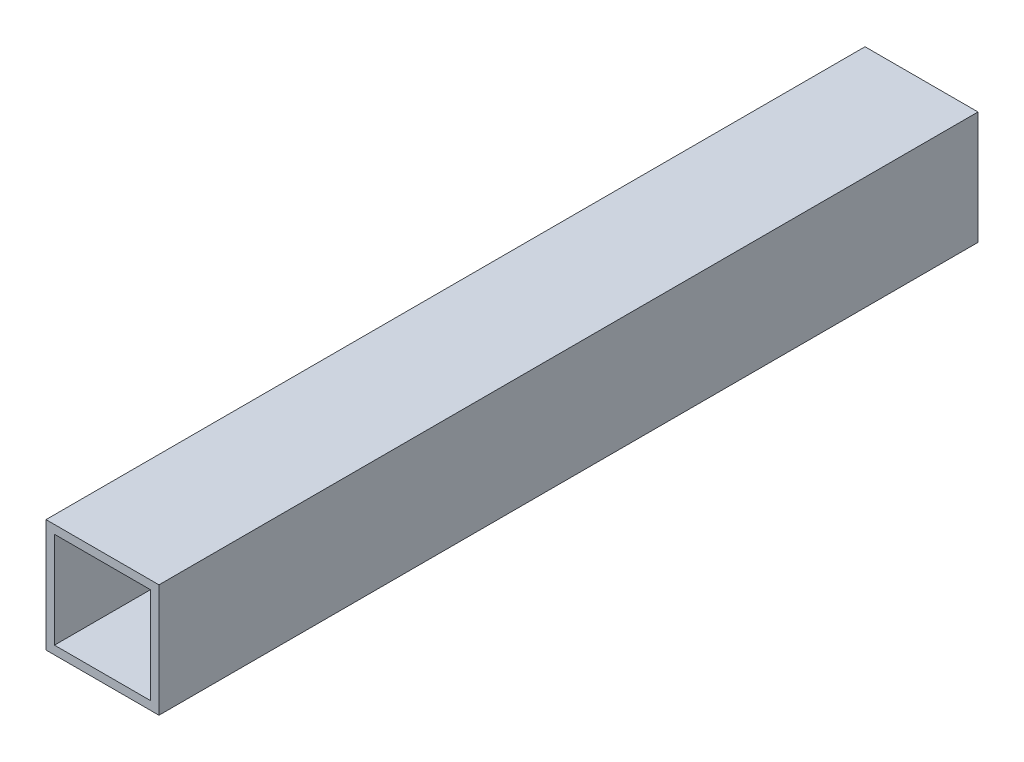
ISO-10303-21;
HEADER;
FILE_DESCRIPTION(('STEP AP214'),'2;1');
FILE_NAME('part.step','',(''),(''),'','','');
FILE_SCHEMA(('AUTOMOTIVE_DESIGN { 1 0 10303 214 1 1 1 1 }'));
ENDSEC;
DATA;
#1=APPLICATION_CONTEXT('core data for automotive mechanical design processes');
#2=APPLICATION_PROTOCOL_DEFINITION('international standard','automotive_design',2000,#1);
#3=PRODUCT_CONTEXT('',#1,'mechanical');
#4=PRODUCT('Part','Part','',(#3));
#5=PRODUCT_RELATED_PRODUCT_CATEGORY('part','',(#4));
#6=PRODUCT_DEFINITION_FORMATION('','',#4);
#7=PRODUCT_DEFINITION_CONTEXT('part definition',#1,'design');
#8=PRODUCT_DEFINITION('design','',#6,#7);
#9=PRODUCT_DEFINITION_SHAPE('','',#8);
#10=(LENGTH_UNIT() NAMED_UNIT(*) SI_UNIT(.MILLI.,.METRE.));
#11=(NAMED_UNIT(*) PLANE_ANGLE_UNIT() SI_UNIT($,.RADIAN.));
#12=(NAMED_UNIT(*) SI_UNIT($,.STERADIAN.) SOLID_ANGLE_UNIT());
#13=UNCERTAINTY_MEASURE_WITH_UNIT(LENGTH_MEASURE(1.E-05),#10,'distance_accuracy_value','');
#14=(GEOMETRIC_REPRESENTATION_CONTEXT(3) GLOBAL_UNCERTAINTY_ASSIGNED_CONTEXT((#13)) GLOBAL_UNIT_ASSIGNED_CONTEXT((#10,
#11,#12)) REPRESENTATION_CONTEXT('',''));
#15=CARTESIAN_POINT('',(0.,0.,0.));
#16=DIRECTION('',(0.,0.,1.));
#17=DIRECTION('',(1.,0.,0.));
#18=AXIS2_PLACEMENT_3D('',#15,#16,#17);
#19=CARTESIAN_POINT('',(0.,0.,72.5));
#20=DIRECTION('',(0.,0.,1.));
#21=DIRECTION('',(1.,0.,0.));
#22=AXIS2_PLACEMENT_3D('',#19,#20,#21);
#23=PLANE('',#22);
#24=DIRECTION('',(1.,0.,0.));
#25=VECTOR('',#24,1.);
#26=CARTESIAN_POINT('',(-10.,-10.,72.5));
#27=LINE('',#26,#25);
#28=CARTESIAN_POINT('',(-10.,-10.,72.5));
#29=VERTEX_POINT('',#28);
#30=CARTESIAN_POINT('',(10.,-10.,72.5));
#31=VERTEX_POINT('',#30);
#32=EDGE_CURVE('E136',#29,#31,#27,.T.);
#33=ORIENTED_EDGE('',*,*,#32,.T.);
#34=DIRECTION('',(0.,1.,0.));
#35=VECTOR('',#34,1.);
#36=CARTESIAN_POINT('',(10.,-10.,72.5));
#37=LINE('',#36,#35);
#38=CARTESIAN_POINT('',(10.,10.,72.5));
#39=VERTEX_POINT('',#38);
#40=EDGE_CURVE('E139',#31,#39,#37,.T.);
#41=ORIENTED_EDGE('',*,*,#40,.T.);
#42=DIRECTION('',(-1.,0.,0.));
#43=VECTOR('',#42,1.);
#44=CARTESIAN_POINT('',(-10.,10.,72.5));
#45=LINE('',#44,#43);
#46=CARTESIAN_POINT('',(-10.,10.,72.5));
#47=VERTEX_POINT('',#46);
#48=EDGE_CURVE('E142',#39,#47,#45,.T.);
#49=ORIENTED_EDGE('',*,*,#48,.T.);
#50=DIRECTION('',(0.,-1.,0.));
#51=VECTOR('',#50,1.);
#52=CARTESIAN_POINT('',(-10.,-10.,72.5));
#53=LINE('',#52,#51);
#54=EDGE_CURVE('E144',#47,#29,#53,.T.);
#55=ORIENTED_EDGE('',*,*,#54,.T.);
#56=EDGE_LOOP('',(#33,#41,#49,#55));
#57=FACE_BOUND('',#56,.T.);
#58=DIRECTION('',(-1.,0.,0.));
#59=VECTOR('',#58,1.);
#60=CARTESIAN_POINT('',(-8.5,8.5,72.5));
#61=LINE('',#60,#59);
#62=CARTESIAN_POINT('',(8.5,8.5,72.5));
#63=VERTEX_POINT('',#62);
#64=CARTESIAN_POINT('',(-8.5,8.5,72.5));
#65=VERTEX_POINT('',#64);
#66=EDGE_CURVE('E108',#63,#65,#61,.T.);
#67=ORIENTED_EDGE('',*,*,#66,.F.);
#68=DIRECTION('',(0.,1.,0.));
#69=VECTOR('',#68,1.);
#70=CARTESIAN_POINT('',(8.5,-8.5,72.5));
#71=LINE('',#70,#69);
#72=CARTESIAN_POINT('',(8.5,-8.5,72.5));
#73=VERTEX_POINT('',#72);
#74=EDGE_CURVE('E100',#73,#63,#71,.T.);
#75=ORIENTED_EDGE('',*,*,#74,.F.);
#76=DIRECTION('',(1.,0.,0.));
#77=VECTOR('',#76,1.);
#78=CARTESIAN_POINT('',(-8.5,-8.5,72.5));
#79=LINE('',#78,#77);
#80=CARTESIAN_POINT('',(-8.5,-8.5,72.5));
#81=VERTEX_POINT('',#80);
#82=EDGE_CURVE('E122',#81,#73,#79,.T.);
#83=ORIENTED_EDGE('',*,*,#82,.F.);
#84=DIRECTION('',(0.,-1.,0.));
#85=VECTOR('',#84,1.);
#86=CARTESIAN_POINT('',(-8.5,-8.5,72.5));
#87=LINE('',#86,#85);
#88=EDGE_CURVE('E120',#65,#81,#87,.T.);
#89=ORIENTED_EDGE('',*,*,#88,.F.);
#90=EDGE_LOOP('',(#67,#75,#83,#89));
#91=FACE_BOUND('',#90,.T.);
#92=ADVANCED_FACE('F35',(#57,#91),#23,.T.);
#93=CARTESIAN_POINT('',(0.,0.,-72.5));
#94=DIRECTION('',(0.,0.,1.));
#95=DIRECTION('',(1.,0.,0.));
#96=AXIS2_PLACEMENT_3D('',#93,#94,#95);
#97=PLANE('',#96);
#98=DIRECTION('',(1.,0.,0.));
#99=VECTOR('',#98,1.);
#100=CARTESIAN_POINT('',(-10.,-10.,-72.5));
#101=LINE('',#100,#99);
#102=CARTESIAN_POINT('',(-10.,-10.,-72.5));
#103=VERTEX_POINT('',#102);
#104=CARTESIAN_POINT('',(10.,-10.,-72.5));
#105=VERTEX_POINT('',#104);
#106=EDGE_CURVE('E116',#103,#105,#101,.T.);
#107=ORIENTED_EDGE('',*,*,#106,.F.);
#108=DIRECTION('',(0.,-1.,0.));
#109=VECTOR('',#108,1.);
#110=CARTESIAN_POINT('',(-10.,-10.,-72.5));
#111=LINE('',#110,#109);
#112=CARTESIAN_POINT('',(-10.,10.,-72.5));
#113=VERTEX_POINT('',#112);
#114=EDGE_CURVE('E140',#113,#103,#111,.T.);
#115=ORIENTED_EDGE('',*,*,#114,.F.);
#116=DIRECTION('',(-1.,0.,0.));
#117=VECTOR('',#116,1.);
#118=CARTESIAN_POINT('',(-10.,10.,-72.5));
#119=LINE('',#118,#117);
#120=CARTESIAN_POINT('',(10.,10.,-72.5));
#121=VERTEX_POINT('',#120);
#122=EDGE_CURVE('E151',#121,#113,#119,.T.);
#123=ORIENTED_EDGE('',*,*,#122,.F.);
#124=DIRECTION('',(0.,1.,0.));
#125=VECTOR('',#124,1.);
#126=CARTESIAN_POINT('',(10.,-10.,-72.5));
#127=LINE('',#126,#125);
#128=EDGE_CURVE('E149',#105,#121,#127,.T.);
#129=ORIENTED_EDGE('',*,*,#128,.F.);
#130=EDGE_LOOP('',(#107,#115,#123,#129));
#131=FACE_BOUND('',#130,.T.);
#132=DIRECTION('',(0.,1.,0.));
#133=VECTOR('',#132,1.);
#134=CARTESIAN_POINT('',(8.5,-8.5,-72.5));
#135=LINE('',#134,#133);
#136=CARTESIAN_POINT('',(8.5,-8.5,-72.5));
#137=VERTEX_POINT('',#136);
#138=CARTESIAN_POINT('',(8.5,8.5,-72.5));
#139=VERTEX_POINT('',#138);
#140=EDGE_CURVE('E58',#137,#139,#135,.T.);
#141=ORIENTED_EDGE('',*,*,#140,.T.);
#142=DIRECTION('',(-1.,0.,0.));
#143=VECTOR('',#142,1.);
#144=CARTESIAN_POINT('',(-8.5,8.5,-72.5));
#145=LINE('',#144,#143);
#146=CARTESIAN_POINT('',(-8.5,8.5,-72.5));
#147=VERTEX_POINT('',#146);
#148=EDGE_CURVE('E115',#139,#147,#145,.T.);
#149=ORIENTED_EDGE('',*,*,#148,.T.);
#150=DIRECTION('',(0.,-1.,0.));
#151=VECTOR('',#150,1.);
#152=CARTESIAN_POINT('',(-8.5,-8.5,-72.5));
#153=LINE('',#152,#151);
#154=CARTESIAN_POINT('',(-8.5,-8.5,-72.5));
#155=VERTEX_POINT('',#154);
#156=EDGE_CURVE('E128',#147,#155,#153,.T.);
#157=ORIENTED_EDGE('',*,*,#156,.T.);
#158=DIRECTION('',(1.,0.,0.));
#159=VECTOR('',#158,1.);
#160=CARTESIAN_POINT('',(-8.5,-8.5,-72.5));
#161=LINE('',#160,#159);
#162=EDGE_CURVE('E109',#155,#137,#161,.T.);
#163=ORIENTED_EDGE('',*,*,#162,.T.);
#164=EDGE_LOOP('',(#141,#149,#157,#163));
#165=FACE_BOUND('',#164,.T.);
#166=ADVANCED_FACE('F169',(#131,#165),#97,.F.);
#167=CARTESIAN_POINT('',(-10.,-10.,72.5));
#168=DIRECTION('',(0.,1.,0.));
#169=DIRECTION('',(0.,0.,1.));
#170=AXIS2_PLACEMENT_3D('',#167,#168,#169);
#171=PLANE('',#170);
#172=ORIENTED_EDGE('',*,*,#106,.T.);
#173=DIRECTION('',(0.,0.,-1.));
#174=VECTOR('',#173,1.);
#175=CARTESIAN_POINT('',(10.,-10.,72.5));
#176=LINE('',#175,#174);
#177=EDGE_CURVE('E11',#31,#105,#176,.T.);
#178=ORIENTED_EDGE('',*,*,#177,.F.);
#179=ORIENTED_EDGE('',*,*,#32,.F.);
#180=DIRECTION('',(0.,0.,-1.));
#181=VECTOR('',#180,1.);
#182=CARTESIAN_POINT('',(-10.,-10.,72.5));
#183=LINE('',#182,#181);
#184=EDGE_CURVE('E146',#29,#103,#183,.T.);
#185=ORIENTED_EDGE('',*,*,#184,.T.);
#186=EDGE_LOOP('',(#172,#178,#179,#185));
#187=FACE_BOUND('',#186,.T.);
#188=ADVANCED_FACE('F37',(#187),#171,.F.);
#189=CARTESIAN_POINT('',(10.,-10.,72.5));
#190=DIRECTION('',(-1.,0.,0.));
#191=DIRECTION('',(0.,0.,1.));
#192=AXIS2_PLACEMENT_3D('',#189,#190,#191);
#193=PLANE('',#192);
#194=ORIENTED_EDGE('',*,*,#128,.T.);
#195=DIRECTION('',(0.,0.,-1.));
#196=VECTOR('',#195,1.);
#197=CARTESIAN_POINT('',(10.,10.,72.5));
#198=LINE('',#197,#196);
#199=EDGE_CURVE('E43',#39,#121,#198,.T.);
#200=ORIENTED_EDGE('',*,*,#199,.F.);
#201=ORIENTED_EDGE('',*,*,#40,.F.);
#202=ORIENTED_EDGE('',*,*,#177,.T.);
#203=EDGE_LOOP('',(#194,#200,#201,#202));
#204=FACE_BOUND('',#203,.T.);
#205=ADVANCED_FACE('F179',(#204),#193,.F.);
#206=CARTESIAN_POINT('',(-10.,10.,72.5));
#207=DIRECTION('',(0.,-1.,0.));
#208=DIRECTION('',(0.,0.,-1.));
#209=AXIS2_PLACEMENT_3D('',#206,#207,#208);
#210=PLANE('',#209);
#211=ORIENTED_EDGE('',*,*,#122,.T.);
#212=DIRECTION('',(0.,0.,-1.));
#213=VECTOR('',#212,1.);
#214=CARTESIAN_POINT('',(-10.,10.,72.5));
#215=LINE('',#214,#213);
#216=EDGE_CURVE('E156',#47,#113,#215,.T.);
#217=ORIENTED_EDGE('',*,*,#216,.F.);
#218=ORIENTED_EDGE('',*,*,#48,.F.);
#219=ORIENTED_EDGE('',*,*,#199,.T.);
#220=EDGE_LOOP('',(#211,#217,#218,#219));
#221=FACE_BOUND('',#220,.T.);
#222=ADVANCED_FACE('F163',(#221),#210,.F.);
#223=CARTESIAN_POINT('',(-10.,-10.,72.5));
#224=DIRECTION('',(1.,0.,0.));
#225=DIRECTION('',(0.,0.,-1.));
#226=AXIS2_PLACEMENT_3D('',#223,#224,#225);
#227=PLANE('',#226);
#228=ORIENTED_EDGE('',*,*,#114,.T.);
#229=ORIENTED_EDGE('',*,*,#184,.F.);
#230=ORIENTED_EDGE('',*,*,#54,.F.);
#231=ORIENTED_EDGE('',*,*,#216,.T.);
#232=EDGE_LOOP('',(#228,#229,#230,#231));
#233=FACE_BOUND('',#232,.T.);
#234=ADVANCED_FACE('F173',(#233),#227,.F.);
#235=CARTESIAN_POINT('',(8.5,-8.5,72.5));
#236=DIRECTION('',(-1.,0.,0.));
#237=DIRECTION('',(0.,0.,1.));
#238=AXIS2_PLACEMENT_3D('',#235,#236,#237);
#239=PLANE('',#238);
#240=ORIENTED_EDGE('',*,*,#140,.F.);
#241=DIRECTION('',(0.,0.,-1.));
#242=VECTOR('',#241,1.);
#243=CARTESIAN_POINT('',(8.5,-8.5,72.5));
#244=LINE('',#243,#242);
#245=EDGE_CURVE('E104',#73,#137,#244,.T.);
#246=ORIENTED_EDGE('',*,*,#245,.F.);
#247=ORIENTED_EDGE('',*,*,#74,.T.);
#248=DIRECTION('',(0.,0.,-1.));
#249=VECTOR('',#248,1.);
#250=CARTESIAN_POINT('',(8.5,8.5,72.5));
#251=LINE('',#250,#249);
#252=EDGE_CURVE('E103',#63,#139,#251,.T.);
#253=ORIENTED_EDGE('',*,*,#252,.T.);
#254=EDGE_LOOP('',(#240,#246,#247,#253));
#255=FACE_BOUND('',#254,.T.);
#256=ADVANCED_FACE('F102',(#255),#239,.T.);
#257=CARTESIAN_POINT('',(-8.5,8.5,72.5));
#258=DIRECTION('',(0.,-1.,0.));
#259=DIRECTION('',(0.,0.,-1.));
#260=AXIS2_PLACEMENT_3D('',#257,#258,#259);
#261=PLANE('',#260);
#262=ORIENTED_EDGE('',*,*,#148,.F.);
#263=ORIENTED_EDGE('',*,*,#252,.F.);
#264=ORIENTED_EDGE('',*,*,#66,.T.);
#265=DIRECTION('',(0.,0.,-1.));
#266=VECTOR('',#265,1.);
#267=CARTESIAN_POINT('',(-8.5,8.5,72.5));
#268=LINE('',#267,#266);
#269=EDGE_CURVE('E117',#65,#147,#268,.T.);
#270=ORIENTED_EDGE('',*,*,#269,.T.);
#271=EDGE_LOOP('',(#262,#263,#264,#270));
#272=FACE_BOUND('',#271,.T.);
#273=ADVANCED_FACE('F112',(#272),#261,.T.);
#274=CARTESIAN_POINT('',(-8.5,-8.5,72.5));
#275=DIRECTION('',(1.,0.,0.));
#276=DIRECTION('',(0.,0.,-1.));
#277=AXIS2_PLACEMENT_3D('',#274,#275,#276);
#278=PLANE('',#277);
#279=ORIENTED_EDGE('',*,*,#156,.F.);
#280=ORIENTED_EDGE('',*,*,#269,.F.);
#281=ORIENTED_EDGE('',*,*,#88,.T.);
#282=DIRECTION('',(0.,0.,-1.));
#283=VECTOR('',#282,1.);
#284=CARTESIAN_POINT('',(-8.5,-8.5,72.5));
#285=LINE('',#284,#283);
#286=EDGE_CURVE('E50',#81,#155,#285,.T.);
#287=ORIENTED_EDGE('',*,*,#286,.T.);
#288=EDGE_LOOP('',(#279,#280,#281,#287));
#289=FACE_BOUND('',#288,.T.);
#290=ADVANCED_FACE('F202',(#289),#278,.T.);
#291=CARTESIAN_POINT('',(-8.5,-8.5,72.5));
#292=DIRECTION('',(0.,1.,0.));
#293=DIRECTION('',(0.,0.,1.));
#294=AXIS2_PLACEMENT_3D('',#291,#292,#293);
#295=PLANE('',#294);
#296=ORIENTED_EDGE('',*,*,#162,.F.);
#297=ORIENTED_EDGE('',*,*,#286,.F.);
#298=ORIENTED_EDGE('',*,*,#82,.T.);
#299=ORIENTED_EDGE('',*,*,#245,.T.);
#300=EDGE_LOOP('',(#296,#297,#298,#299));
#301=FACE_BOUND('',#300,.T.);
#302=ADVANCED_FACE('F206',(#301),#295,.T.);
#303=CLOSED_SHELL('',(#92,#166,#188,#205,#222,#234,#256,#273,#290,#302));
#304=MANIFOLD_SOLID_BREP('B2',#303);
#305=ADVANCED_BREP_SHAPE_REPRESENTATION('',(#18,#304),#14);
#306=SHAPE_DEFINITION_REPRESENTATION(#9,#305);
ENDSEC;
END-ISO-10303-21;
